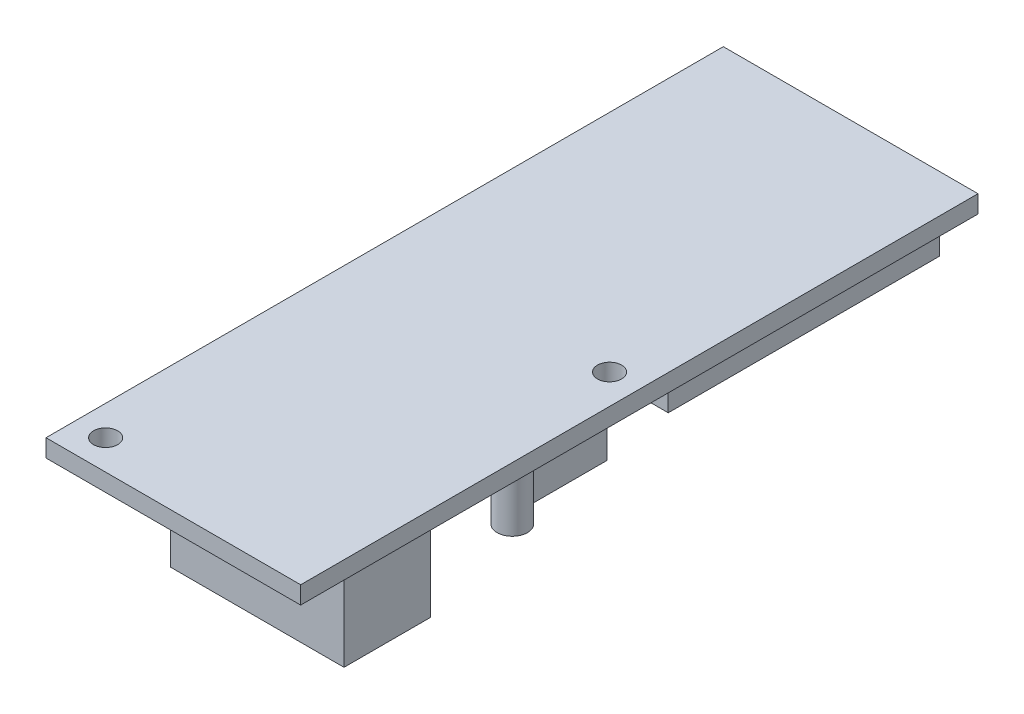
ISO-10303-21;
HEADER;
FILE_DESCRIPTION(('STEP AP214'),'2;1');
FILE_NAME('part.step','',(''),(''),'','','');
FILE_SCHEMA(('AUTOMOTIVE_DESIGN { 1 0 10303 214 1 1 1 1 }'));
ENDSEC;
DATA;
#1=APPLICATION_CONTEXT('core data for automotive mechanical design processes');
#2=APPLICATION_PROTOCOL_DEFINITION('international standard','automotive_design',2000,#1);
#3=PRODUCT_CONTEXT('',#1,'mechanical');
#4=PRODUCT('Part','Part','',(#3));
#5=PRODUCT_RELATED_PRODUCT_CATEGORY('part','',(#4));
#6=PRODUCT_DEFINITION_FORMATION('','',#4);
#7=PRODUCT_DEFINITION_CONTEXT('part definition',#1,'design');
#8=PRODUCT_DEFINITION('design','',#6,#7);
#9=PRODUCT_DEFINITION_SHAPE('','',#8);
#10=(LENGTH_UNIT() NAMED_UNIT(*) SI_UNIT(.MILLI.,.METRE.));
#11=(NAMED_UNIT(*) PLANE_ANGLE_UNIT() SI_UNIT($,.RADIAN.));
#12=(NAMED_UNIT(*) SI_UNIT($,.STERADIAN.) SOLID_ANGLE_UNIT());
#13=UNCERTAINTY_MEASURE_WITH_UNIT(LENGTH_MEASURE(1.E-05),#10,'distance_accuracy_value','');
#14=(GEOMETRIC_REPRESENTATION_CONTEXT(3) GLOBAL_UNCERTAINTY_ASSIGNED_CONTEXT((#13)) GLOBAL_UNIT_ASSIGNED_CONTEXT((#10,
#11,#12)) REPRESENTATION_CONTEXT('',''));
#15=CARTESIAN_POINT('',(0.,0.,0.));
#16=DIRECTION('',(0.,0.,1.));
#17=DIRECTION('',(1.,0.,0.));
#18=AXIS2_PLACEMENT_3D('',#15,#16,#17);
#19=CARTESIAN_POINT('',(-2.69215607971696,-10.7696,4.61445895033206));
#20=DIRECTION('',(0.00341761482106001,0.,0.999994159937414));
#21=DIRECTION('',(0.999994159937414,0.,-0.00341761482106001));
#22=AXIS2_PLACEMENT_3D('',#19,#20,#21);
#23=PLANE('',#22);
#24=DIRECTION('',(0.999994159937414,0.,-0.00341761482106001));
#25=VECTOR('',#24,1.);
#26=CARTESIAN_POINT('',(-2.69215607971696,-1.651,4.61445895033206));
#27=LINE('',#26,#25);
#28=CARTESIAN_POINT('',(-10.820156079717,-1.651,4.64223748582602));
#29=VERTEX_POINT('',#28);
#30=CARTESIAN_POINT('',(5.43584392028302,-1.651,4.5866804148381));
#31=VERTEX_POINT('',#30);
#32=EDGE_CURVE('E434',#29,#31,#27,.T.);
#33=ORIENTED_EDGE('',*,*,#32,.F.);
#34=DIRECTION('',(0.,1.,0.));
#35=VECTOR('',#34,1.);
#36=CARTESIAN_POINT('',(-10.820156079717,-10.7696,4.64223748582602));
#37=LINE('',#36,#35);
#38=CARTESIAN_POINT('',(-10.820156079717,-10.7696,4.64223748582602));
#39=VERTEX_POINT('',#38);
#40=EDGE_CURVE('E10',#39,#29,#37,.T.);
#41=ORIENTED_EDGE('',*,*,#40,.F.);
#42=DIRECTION('',(0.999994159937414,0.,-0.00341761482106001));
#43=VECTOR('',#42,1.);
#44=CARTESIAN_POINT('',(-2.69215607971696,-10.7696,4.61445895033206));
#45=LINE('',#44,#43);
#46=CARTESIAN_POINT('',(5.43584392028302,-10.7696,4.5866804148381));
#47=VERTEX_POINT('',#46);
#48=EDGE_CURVE('E435',#39,#47,#45,.T.);
#49=ORIENTED_EDGE('',*,*,#48,.T.);
#50=DIRECTION('',(0.,1.,0.));
#51=VECTOR('',#50,1.);
#52=CARTESIAN_POINT('',(5.43584392028302,-10.7696,4.5866804148381));
#53=LINE('',#52,#51);
#54=EDGE_CURVE('E38',#47,#31,#53,.T.);
#55=ORIENTED_EDGE('',*,*,#54,.T.);
#56=EDGE_LOOP('',(#33,#41,#49,#55));
#57=FACE_BOUND('',#56,.T.);
#58=ADVANCED_FACE('F16',(#57),#23,.T.);
#59=CARTESIAN_POINT('',(-10.820156079717,-10.7696,0.578237485826018));
#60=DIRECTION('',(1.,0.,0.));
#61=DIRECTION('',(0.,0.,-1.));
#62=AXIS2_PLACEMENT_3D('',#59,#60,#61);
#63=PLANE('',#62);
#64=DIRECTION('',(0.,0.,-1.));
#65=VECTOR('',#64,1.);
#66=CARTESIAN_POINT('',(-10.820156079717,-1.651,0.578237485826018));
#67=LINE('',#66,#65);
#68=CARTESIAN_POINT('',(-10.820156079717,-1.651,-3.48576251417398));
#69=VERTEX_POINT('',#68);
#70=EDGE_CURVE('E58',#29,#69,#67,.T.);
#71=ORIENTED_EDGE('',*,*,#70,.T.);
#72=DIRECTION('',(0.,1.,0.));
#73=VECTOR('',#72,1.);
#74=CARTESIAN_POINT('',(-10.820156079717,-10.7696,-3.48576251417398));
#75=LINE('',#74,#73);
#76=CARTESIAN_POINT('',(-10.820156079717,-10.7696,-3.48576251417398));
#77=VERTEX_POINT('',#76);
#78=EDGE_CURVE('E25',#77,#69,#75,.T.);
#79=ORIENTED_EDGE('',*,*,#78,.F.);
#80=DIRECTION('',(0.,0.,-1.));
#81=VECTOR('',#80,1.);
#82=CARTESIAN_POINT('',(-10.820156079717,-10.7696,0.578237485826018));
#83=LINE('',#82,#81);
#84=EDGE_CURVE('E438',#39,#77,#83,.T.);
#85=ORIENTED_EDGE('',*,*,#84,.F.);
#86=ORIENTED_EDGE('',*,*,#40,.T.);
#87=EDGE_LOOP('',(#71,#79,#85,#86));
#88=FACE_BOUND('',#87,.T.);
#89=ADVANCED_FACE('F479',(#88),#63,.F.);
#90=CARTESIAN_POINT('',(-2.69215607971698,-10.7696,-3.48576251417398));
#91=DIRECTION('',(0.,0.,1.));
#92=DIRECTION('',(1.,0.,0.));
#93=AXIS2_PLACEMENT_3D('',#90,#91,#92);
#94=PLANE('',#93);
#95=DIRECTION('',(1.,0.,0.));
#96=VECTOR('',#95,1.);
#97=CARTESIAN_POINT('',(-2.69215607971698,-1.651,-3.48576251417398));
#98=LINE('',#97,#96);
#99=CARTESIAN_POINT('',(5.43584392028302,-1.651,-3.48576251417398));
#100=VERTEX_POINT('',#99);
#101=EDGE_CURVE('E453',#69,#100,#98,.T.);
#102=ORIENTED_EDGE('',*,*,#101,.T.);
#103=DIRECTION('',(0.,1.,0.));
#104=VECTOR('',#103,1.);
#105=CARTESIAN_POINT('',(5.43584392028302,-10.7696,-3.48576251417398));
#106=LINE('',#105,#104);
#107=CARTESIAN_POINT('',(5.43584392028302,-10.7696,-3.48576251417398));
#108=VERTEX_POINT('',#107);
#109=EDGE_CURVE('E461',#108,#100,#106,.T.);
#110=ORIENTED_EDGE('',*,*,#109,.F.);
#111=DIRECTION('',(1.,0.,0.));
#112=VECTOR('',#111,1.);
#113=CARTESIAN_POINT('',(-2.69215607971698,-10.7696,-3.48576251417398));
#114=LINE('',#113,#112);
#115=EDGE_CURVE('E442',#77,#108,#114,.T.);
#116=ORIENTED_EDGE('',*,*,#115,.F.);
#117=ORIENTED_EDGE('',*,*,#78,.T.);
#118=EDGE_LOOP('',(#102,#110,#116,#117));
#119=FACE_BOUND('',#118,.T.);
#120=ADVANCED_FACE('F469',(#119),#94,.F.);
#121=CARTESIAN_POINT('',(5.43584392028302,-10.7696,0.550458950332057));
#122=DIRECTION('',(1.,0.,0.));
#123=DIRECTION('',(0.,0.,-1.));
#124=AXIS2_PLACEMENT_3D('',#121,#122,#123);
#125=PLANE('',#124);
#126=DIRECTION('',(0.,0.,-1.));
#127=VECTOR('',#126,1.);
#128=CARTESIAN_POINT('',(5.43584392028302,-1.651,0.550458950332057));
#129=LINE('',#128,#127);
#130=EDGE_CURVE('E439',#31,#100,#129,.T.);
#131=ORIENTED_EDGE('',*,*,#130,.F.);
#132=ORIENTED_EDGE('',*,*,#54,.F.);
#133=DIRECTION('',(0.,0.,-1.));
#134=VECTOR('',#133,1.);
#135=CARTESIAN_POINT('',(5.43584392028302,-10.7696,0.550458950332057));
#136=LINE('',#135,#134);
#137=EDGE_CURVE('E445',#47,#108,#136,.T.);
#138=ORIENTED_EDGE('',*,*,#137,.T.);
#139=ORIENTED_EDGE('',*,*,#109,.T.);
#140=EDGE_LOOP('',(#131,#132,#138,#139));
#141=FACE_BOUND('',#140,.T.);
#142=ADVANCED_FACE('F474',(#141),#125,.T.);
#143=CARTESIAN_POINT('',(17.6685890672207,-10.7696,0.));
#144=DIRECTION('',(0.,-1.,0.));
#145=DIRECTION('',(1.,0.,0.));
#146=AXIS2_PLACEMENT_3D('',#143,#144,#145);
#147=PLANE('',#146);
#148=ORIENTED_EDGE('',*,*,#48,.F.);
#149=ORIENTED_EDGE('',*,*,#84,.T.);
#150=ORIENTED_EDGE('',*,*,#115,.T.);
#151=ORIENTED_EDGE('',*,*,#137,.F.);
#152=EDGE_LOOP('',(#148,#149,#150,#151));
#153=FACE_BOUND('',#152,.T.);
#154=ADVANCED_FACE('F478',(#153),#147,.T.);
#155=CARTESIAN_POINT('',(0.,-1.651,0.));
#156=DIRECTION('',(0.,-1.,0.));
#157=DIRECTION('',(1.,0.,0.));
#158=AXIS2_PLACEMENT_3D('',#155,#156,#157);
#159=PLANE('',#158);
#160=ORIENTED_EDGE('',*,*,#70,.F.);
#161=ORIENTED_EDGE('',*,*,#32,.T.);
#162=ORIENTED_EDGE('',*,*,#130,.T.);
#163=ORIENTED_EDGE('',*,*,#101,.F.);
#164=EDGE_LOOP('',(#160,#161,#162,#163));
#165=FACE_BOUND('',#164,.T.);
#166=DIRECTION('',(1.,0.,0.));
#167=VECTOR('',#166,1.);
#168=CARTESIAN_POINT('',(1.77768610461801,-1.651,25.6540042306036));
#169=LINE('',#168,#167);
#170=CARTESIAN_POINT('',(-6.35031389538199,-1.651,25.6540042306036));
#171=VERTEX_POINT('',#170);
#172=CARTESIAN_POINT('',(9.90568610461802,-1.651,25.6540042306036));
#173=VERTEX_POINT('',#172);
#174=EDGE_CURVE('E232',#171,#173,#169,.T.);
#175=ORIENTED_EDGE('',*,*,#174,.T.);
#176=DIRECTION('',(0.,0.,-1.));
#177=VECTOR('',#176,1.);
#178=CARTESIAN_POINT('',(9.90568610461802,-1.651,21.5900042306036));
#179=LINE('',#178,#177);
#180=CARTESIAN_POINT('',(9.90568610461802,-1.651,17.5260042306035));
#181=VERTEX_POINT('',#180);
#182=EDGE_CURVE('E217',#173,#181,#179,.T.);
#183=ORIENTED_EDGE('',*,*,#182,.T.);
#184=DIRECTION('',(1.,0.,0.));
#185=VECTOR('',#184,1.);
#186=CARTESIAN_POINT('',(1.77768610461801,-1.651,17.5260042306035));
#187=LINE('',#186,#185);
#188=CARTESIAN_POINT('',(-6.35031389538198,-1.651,17.5260042306035));
#189=VERTEX_POINT('',#188);
#190=EDGE_CURVE('E249',#189,#181,#187,.T.);
#191=ORIENTED_EDGE('',*,*,#190,.F.);
#192=DIRECTION('',(0.,0.,-1.));
#193=VECTOR('',#192,1.);
#194=CARTESIAN_POINT('',(-6.35031389538199,-1.651,21.5900042306036));
#195=LINE('',#194,#193);
#196=EDGE_CURVE('E253',#171,#189,#195,.T.);
#197=ORIENTED_EDGE('',*,*,#196,.F.);
#198=EDGE_LOOP('',(#175,#183,#191,#197));
#199=FACE_BOUND('',#198,.T.);
#200=CARTESIAN_POINT('',(8.91875382512808,-1.651,8.89));
#201=DIRECTION('',(0.,-1.,0.));
#202=DIRECTION('',(0.,0.,-1.));
#203=AXIS2_PLACEMENT_3D('',#200,#201,#202);
#204=CIRCLE('',#203,1.4224);
#205=CARTESIAN_POINT('',(8.91875382512808,-1.651,7.4676));
#206=VERTEX_POINT('',#205);
#207=EDGE_CURVE('E261',#206,#206,#204,.T.);
#208=ORIENTED_EDGE('',*,*,#207,.F.);
#209=EDGE_LOOP('',(#208));
#210=FACE_BOUND('',#209,.T.);
#211=CARTESIAN_POINT('',(-9.30180866271257,-1.651,21.5009637176991));
#212=DIRECTION('',(0.,-1.,0.));
#213=DIRECTION('',(0.,0.,-1.));
#214=AXIS2_PLACEMENT_3D('',#211,#212,#213);
#215=CIRCLE('',#214,1.5875);
#216=CARTESIAN_POINT('',(-9.30180866271257,-1.651,19.9134637176991));
#217=VERTEX_POINT('',#216);
#218=EDGE_CURVE('E271',#217,#217,#215,.T.);
#219=ORIENTED_EDGE('',*,*,#218,.F.);
#220=EDGE_LOOP('',(#219));
#221=FACE_BOUND('',#220,.T.);
#222=DIRECTION('',(1.,0.,0.));
#223=VECTOR('',#222,1.);
#224=CARTESIAN_POINT('',(-10.1213033776045,-1.651,-18.3387992003917));
#225=LINE('',#224,#223);
#226=CARTESIAN_POINT('',(-11.3214533776045,-1.651,-18.3387992003917));
#227=VERTEX_POINT('',#226);
#228=CARTESIAN_POINT('',(-8.92115337760448,-1.651,-18.3387992003917));
#229=VERTEX_POINT('',#228);
#230=EDGE_CURVE('E279',#227,#229,#225,.T.);
#231=ORIENTED_EDGE('',*,*,#230,.T.);
#232=DIRECTION('',(0.,0.,-1.));
#233=VECTOR('',#232,1.);
#234=CARTESIAN_POINT('',(-8.92115337760448,-1.651,-20.8279992003917));
#235=LINE('',#234,#233);
#236=CARTESIAN_POINT('',(-8.92115337760448,-1.651,-23.3171992003917));
#237=VERTEX_POINT('',#236);
#238=EDGE_CURVE('E288',#229,#237,#235,.T.);
#239=ORIENTED_EDGE('',*,*,#238,.T.);
#240=DIRECTION('',(1.,0.,0.));
#241=VECTOR('',#240,1.);
#242=CARTESIAN_POINT('',(-10.1213033776045,-1.651,-23.3171992003917));
#243=LINE('',#242,#241);
#244=CARTESIAN_POINT('',(-11.3214533776045,-1.651,-23.3171992003917));
#245=VERTEX_POINT('',#244);
#246=EDGE_CURVE('E305',#245,#237,#243,.T.);
#247=ORIENTED_EDGE('',*,*,#246,.F.);
#248=DIRECTION('',(0.,0.,-1.));
#249=VECTOR('',#248,1.);
#250=CARTESIAN_POINT('',(-11.3214533776045,-1.651,-20.8279992003917));
#251=LINE('',#250,#249);
#252=EDGE_CURVE('E301',#227,#245,#251,.T.);
#253=ORIENTED_EDGE('',*,*,#252,.F.);
#254=EDGE_LOOP('',(#231,#239,#247,#253));
#255=FACE_BOUND('',#254,.T.);
#256=CARTESIAN_POINT('',(9.144,-1.651,0.));
#257=DIRECTION('',(0.,-1.,0.));
#258=DIRECTION('',(0.,0.,-1.));
#259=AXIS2_PLACEMENT_3D('',#256,#257,#258);
#260=CIRCLE('',#259,1.1303);
#261=CARTESIAN_POINT('',(9.144,-1.651,-1.1303));
#262=VERTEX_POINT('',#261);
#263=EDGE_CURVE('E338',#262,#262,#260,.F.);
#264=ORIENTED_EDGE('',*,*,#263,.T.);
#265=EDGE_LOOP('',(#264));
#266=FACE_BOUND('',#265,.T.);
#267=CARTESIAN_POINT('',(-9.144,-1.651,28.956));
#268=DIRECTION('',(0.,-1.,0.));
#269=DIRECTION('',(0.,0.,-1.));
#270=AXIS2_PLACEMENT_3D('',#267,#268,#269);
#271=CIRCLE('',#270,1.1303);
#272=CARTESIAN_POINT('',(-9.144,-1.651,27.8257));
#273=VERTEX_POINT('',#272);
#274=EDGE_CURVE('E331',#273,#273,#271,.F.);
#275=ORIENTED_EDGE('',*,*,#274,.T.);
#276=EDGE_LOOP('',(#275));
#277=FACE_BOUND('',#276,.T.);
#278=DIRECTION('',(1.,0.,0.));
#279=VECTOR('',#278,1.);
#280=CARTESIAN_POINT('',(0.0429229611926003,-1.651,-6.35));
#281=LINE('',#280,#279);
#282=CARTESIAN_POINT('',(-8.2120770388074,-1.651,-6.35));
#283=VERTEX_POINT('',#282);
#284=CARTESIAN_POINT('',(8.2979229611926,-1.651,-6.35));
#285=VERTEX_POINT('',#284);
#286=EDGE_CURVE('E347',#283,#285,#281,.T.);
#287=ORIENTED_EDGE('',*,*,#286,.T.);
#288=DIRECTION('',(0.,0.,-1.));
#289=VECTOR('',#288,1.);
#290=CARTESIAN_POINT('',(8.2979229611926,-1.651,-19.0563597335608));
#291=LINE('',#290,#289);
#292=CARTESIAN_POINT('',(8.29792296119261,-1.651,-31.75));
#293=VERTEX_POINT('',#292);
#294=EDGE_CURVE('E368',#285,#293,#291,.T.);
#295=ORIENTED_EDGE('',*,*,#294,.T.);
#296=DIRECTION('',(-1.,0.,0.));
#297=VECTOR('',#296,1.);
#298=CARTESIAN_POINT('',(0.,-1.651,-31.75));
#299=LINE('',#298,#297);
#300=CARTESIAN_POINT('',(11.938,-1.651,-31.75));
#301=VERTEX_POINT('',#300);
#302=EDGE_CURVE('E403',#301,#293,#299,.T.);
#303=ORIENTED_EDGE('',*,*,#302,.F.);
#304=DIRECTION('',(0.,0.,-1.));
#305=VECTOR('',#304,1.);
#306=CARTESIAN_POINT('',(11.938,-1.651,0.));
#307=LINE('',#306,#305);
#308=CARTESIAN_POINT('',(11.938,-1.651,31.75));
#309=VERTEX_POINT('',#308);
#310=EDGE_CURVE('E390',#309,#301,#307,.T.);
#311=ORIENTED_EDGE('',*,*,#310,.F.);
#312=DIRECTION('',(-1.,0.,0.));
#313=VECTOR('',#312,1.);
#314=CARTESIAN_POINT('',(0.,-1.651,31.75));
#315=LINE('',#314,#313);
#316=CARTESIAN_POINT('',(-11.938,-1.651,31.75));
#317=VERTEX_POINT('',#316);
#318=EDGE_CURVE('E394',#309,#317,#315,.T.);
#319=ORIENTED_EDGE('',*,*,#318,.T.);
#320=DIRECTION('',(0.,0.,-1.));
#321=VECTOR('',#320,1.);
#322=CARTESIAN_POINT('',(-11.938,-1.651,0.));
#323=LINE('',#322,#321);
#324=CARTESIAN_POINT('',(-11.938,-1.651,-31.75));
#325=VERTEX_POINT('',#324);
#326=EDGE_CURVE('E398',#317,#325,#323,.T.);
#327=ORIENTED_EDGE('',*,*,#326,.T.);
#328=CARTESIAN_POINT('',(-8.2120770388074,-1.651,-31.75));
#329=VERTEX_POINT('',#328);
#330=EDGE_CURVE('E402',#329,#325,#299,.T.);
#331=ORIENTED_EDGE('',*,*,#330,.F.);
#332=DIRECTION('',(0.,0.,-1.));
#333=VECTOR('',#332,1.);
#334=CARTESIAN_POINT('',(-8.2120770388074,-1.651,-19.0563597335608));
#335=LINE('',#334,#333);
#336=EDGE_CURVE('E359',#283,#329,#335,.T.);
#337=ORIENTED_EDGE('',*,*,#336,.F.);
#338=EDGE_LOOP('',(#287,#295,#303,#311,#319,#327,#331,#337));
#339=FACE_BOUND('',#338,.T.);
#340=ADVANCED_FACE('F472',(#165,#199,#210,#221,#255,#266,#277,#339),#159,.T.);
#341=CARTESIAN_POINT('',(11.938,-1.651,0.));
#342=DIRECTION('',(1.,0.,0.));
#343=DIRECTION('',(0.,0.,-1.));
#344=AXIS2_PLACEMENT_3D('',#341,#342,#343);
#345=PLANE('',#344);
#346=DIRECTION('',(0.,0.,-1.));
#347=VECTOR('',#346,1.);
#348=CARTESIAN_POINT('',(11.938,0.,0.));
#349=LINE('',#348,#347);
#350=CARTESIAN_POINT('',(11.938,0.,31.75));
#351=VERTEX_POINT('',#350);
#352=CARTESIAN_POINT('',(11.938,0.,-31.75));
#353=VERTEX_POINT('',#352);
#354=EDGE_CURVE('E379',#351,#353,#349,.T.);
#355=ORIENTED_EDGE('',*,*,#354,.F.);
#356=DIRECTION('',(0.,1.,0.));
#357=VECTOR('',#356,1.);
#358=CARTESIAN_POINT('',(11.938,-1.651,31.75));
#359=LINE('',#358,#357);
#360=EDGE_CURVE('E431',#309,#351,#359,.T.);
#361=ORIENTED_EDGE('',*,*,#360,.F.);
#362=ORIENTED_EDGE('',*,*,#310,.T.);
#363=DIRECTION('',(0.,1.,0.));
#364=VECTOR('',#363,1.);
#365=CARTESIAN_POINT('',(11.938,-1.651,-31.75));
#366=LINE('',#365,#364);
#367=EDGE_CURVE('E407',#301,#353,#366,.T.);
#368=ORIENTED_EDGE('',*,*,#367,.T.);
#369=EDGE_LOOP('',(#355,#361,#362,#368));
#370=FACE_BOUND('',#369,.T.);
#371=ADVANCED_FACE('F494',(#370),#345,.T.);
#372=CARTESIAN_POINT('',(0.,-1.651,31.75));
#373=DIRECTION('',(0.,0.,-1.));
#374=DIRECTION('',(-1.,0.,0.));
#375=AXIS2_PLACEMENT_3D('',#372,#373,#374);
#376=PLANE('',#375);
#377=DIRECTION('',(-1.,0.,0.));
#378=VECTOR('',#377,1.);
#379=CARTESIAN_POINT('',(0.,0.,31.75));
#380=LINE('',#379,#378);
#381=CARTESIAN_POINT('',(-11.938,0.,31.75));
#382=VERTEX_POINT('',#381);
#383=EDGE_CURVE('E412',#351,#382,#380,.T.);
#384=ORIENTED_EDGE('',*,*,#383,.T.);
#385=DIRECTION('',(0.,1.,0.));
#386=VECTOR('',#385,1.);
#387=CARTESIAN_POINT('',(-11.938,-1.651,31.75));
#388=LINE('',#387,#386);
#389=EDGE_CURVE('E427',#317,#382,#388,.T.);
#390=ORIENTED_EDGE('',*,*,#389,.F.);
#391=ORIENTED_EDGE('',*,*,#318,.F.);
#392=ORIENTED_EDGE('',*,*,#360,.T.);
#393=EDGE_LOOP('',(#384,#390,#391,#392));
#394=FACE_BOUND('',#393,.T.);
#395=ADVANCED_FACE('F497',(#394),#376,.F.);
#396=CARTESIAN_POINT('',(-11.938,-1.651,0.));
#397=DIRECTION('',(1.,0.,0.));
#398=DIRECTION('',(0.,0.,-1.));
#399=AXIS2_PLACEMENT_3D('',#396,#397,#398);
#400=PLANE('',#399);
#401=DIRECTION('',(0.,0.,-1.));
#402=VECTOR('',#401,1.);
#403=CARTESIAN_POINT('',(-11.938,0.,0.));
#404=LINE('',#403,#402);
#405=CARTESIAN_POINT('',(-11.938,0.,-31.75));
#406=VERTEX_POINT('',#405);
#407=EDGE_CURVE('E415',#382,#406,#404,.T.);
#408=ORIENTED_EDGE('',*,*,#407,.T.);
#409=DIRECTION('',(0.,1.,0.));
#410=VECTOR('',#409,1.);
#411=CARTESIAN_POINT('',(-11.938,-1.651,-31.75));
#412=LINE('',#411,#410);
#413=EDGE_CURVE('E424',#325,#406,#412,.T.);
#414=ORIENTED_EDGE('',*,*,#413,.F.);
#415=ORIENTED_EDGE('',*,*,#326,.F.);
#416=ORIENTED_EDGE('',*,*,#389,.T.);
#417=EDGE_LOOP('',(#408,#414,#415,#416));
#418=FACE_BOUND('',#417,.T.);
#419=ADVANCED_FACE('F501',(#418),#400,.F.);
#420=CARTESIAN_POINT('',(0.,-1.651,-31.75));
#421=DIRECTION('',(0.,0.,-1.));
#422=DIRECTION('',(-1.,0.,0.));
#423=AXIS2_PLACEMENT_3D('',#420,#421,#422);
#424=PLANE('',#423);
#425=DIRECTION('',(-1.,0.,0.));
#426=VECTOR('',#425,1.);
#427=CARTESIAN_POINT('',(0.,0.,-31.75));
#428=LINE('',#427,#426);
#429=EDGE_CURVE('E395',#353,#406,#428,.T.);
#430=ORIENTED_EDGE('',*,*,#429,.F.);
#431=ORIENTED_EDGE('',*,*,#367,.F.);
#432=ORIENTED_EDGE('',*,*,#302,.T.);
#433=EDGE_CURVE('E408',#293,#329,#299,.T.);
#434=ORIENTED_EDGE('',*,*,#433,.T.);
#435=ORIENTED_EDGE('',*,*,#330,.T.);
#436=ORIENTED_EDGE('',*,*,#413,.T.);
#437=EDGE_LOOP('',(#430,#431,#432,#434,#435,#436));
#438=FACE_BOUND('',#437,.T.);
#439=ADVANCED_FACE('F505',(#438),#424,.T.);
#440=CARTESIAN_POINT('',(0.,0.,0.));
#441=DIRECTION('',(0.,-1.,0.));
#442=DIRECTION('',(1.,0.,0.));
#443=AXIS2_PLACEMENT_3D('',#440,#441,#442);
#444=PLANE('',#443);
#445=CARTESIAN_POINT('',(9.144,0.,0.));
#446=DIRECTION('',(0.,1.,0.));
#447=DIRECTION('',(0.,0.,1.));
#448=AXIS2_PLACEMENT_3D('',#445,#446,#447);
#449=CIRCLE('',#448,1.1303);
#450=CARTESIAN_POINT('',(9.144,0.,1.1303));
#451=VERTEX_POINT('',#450);
#452=EDGE_CURVE('E327',#451,#451,#449,.T.);
#453=ORIENTED_EDGE('',*,*,#452,.F.);
#454=EDGE_LOOP('',(#453));
#455=FACE_BOUND('',#454,.T.);
#456=CARTESIAN_POINT('',(-9.144,0.,28.956));
#457=DIRECTION('',(0.,1.,0.));
#458=DIRECTION('',(0.,0.,1.));
#459=AXIS2_PLACEMENT_3D('',#456,#457,#458);
#460=CIRCLE('',#459,1.1303);
#461=CARTESIAN_POINT('',(-9.144,0.,30.0863));
#462=VERTEX_POINT('',#461);
#463=EDGE_CURVE('E326',#462,#462,#460,.T.);
#464=ORIENTED_EDGE('',*,*,#463,.F.);
#465=EDGE_LOOP('',(#464));
#466=FACE_BOUND('',#465,.T.);
#467=ORIENTED_EDGE('',*,*,#354,.T.);
#468=ORIENTED_EDGE('',*,*,#429,.T.);
#469=ORIENTED_EDGE('',*,*,#407,.F.);
#470=ORIENTED_EDGE('',*,*,#383,.F.);
#471=EDGE_LOOP('',(#467,#468,#469,#470));
#472=FACE_BOUND('',#471,.T.);
#473=ADVANCED_FACE('F509',(#455,#466,#472),#444,.F.);
#474=CARTESIAN_POINT('',(8.2979229611926,-6.91134,-19.0563597335608));
#475=DIRECTION('',(1.,0.,0.));
#476=DIRECTION('',(0.,0.,-1.));
#477=AXIS2_PLACEMENT_3D('',#474,#475,#476);
#478=PLANE('',#477);
#479=ORIENTED_EDGE('',*,*,#294,.F.);
#480=DIRECTION('',(0.,1.,0.));
#481=VECTOR('',#480,1.);
#482=CARTESIAN_POINT('',(8.2979229611926,-6.91134,-6.35));
#483=LINE('',#482,#481);
#484=CARTESIAN_POINT('',(8.2979229611926,-6.91134,-6.35));
#485=VERTEX_POINT('',#484);
#486=EDGE_CURVE('E375',#485,#285,#483,.T.);
#487=ORIENTED_EDGE('',*,*,#486,.F.);
#488=DIRECTION('',(0.,0.,-1.));
#489=VECTOR('',#488,1.);
#490=CARTESIAN_POINT('',(8.2979229611926,-6.91134,-19.0563597335608));
#491=LINE('',#490,#489);
#492=CARTESIAN_POINT('',(8.29792296119261,-6.91134,-31.7627194671216));
#493=VERTEX_POINT('',#492);
#494=EDGE_CURVE('E350',#485,#493,#491,.T.);
#495=ORIENTED_EDGE('',*,*,#494,.T.);
#496=DIRECTION('',(0.,1.,0.));
#497=VECTOR('',#496,1.);
#498=CARTESIAN_POINT('',(8.29792296119261,-6.91134,-31.7627194671216));
#499=LINE('',#498,#497);
#500=CARTESIAN_POINT('',(8.29792296119261,-1.651,-31.7627194671216));
#501=VERTEX_POINT('',#500);
#502=EDGE_CURVE('E358',#493,#501,#499,.T.);
#503=ORIENTED_EDGE('',*,*,#502,.T.);
#504=EDGE_CURVE('E367',#293,#501,#291,.T.);
#505=ORIENTED_EDGE('',*,*,#504,.F.);
#506=EDGE_LOOP('',(#479,#487,#495,#503,#505));
#507=FACE_BOUND('',#506,.T.);
#508=ADVANCED_FACE('F513',(#507),#478,.T.);
#509=CARTESIAN_POINT('',(0.0429229611926003,-6.91134,-6.35));
#510=DIRECTION('',(0.,0.,1.));
#511=DIRECTION('',(1.,0.,0.));
#512=AXIS2_PLACEMENT_3D('',#509,#510,#511);
#513=PLANE('',#512);
#514=ORIENTED_EDGE('',*,*,#286,.F.);
#515=DIRECTION('',(0.,1.,0.));
#516=VECTOR('',#515,1.);
#517=CARTESIAN_POINT('',(-8.2120770388074,-6.91134,-6.35));
#518=LINE('',#517,#516);
#519=CARTESIAN_POINT('',(-8.2120770388074,-6.91134,-6.35));
#520=VERTEX_POINT('',#519);
#521=EDGE_CURVE('E380',#520,#283,#518,.T.);
#522=ORIENTED_EDGE('',*,*,#521,.F.);
#523=DIRECTION('',(1.,0.,0.));
#524=VECTOR('',#523,1.);
#525=CARTESIAN_POINT('',(0.0429229611926003,-6.91134,-6.35));
#526=LINE('',#525,#524);
#527=EDGE_CURVE('E354',#520,#485,#526,.T.);
#528=ORIENTED_EDGE('',*,*,#527,.T.);
#529=ORIENTED_EDGE('',*,*,#486,.T.);
#530=EDGE_LOOP('',(#514,#522,#528,#529));
#531=FACE_BOUND('',#530,.T.);
#532=ADVANCED_FACE('F521',(#531),#513,.T.);
#533=CARTESIAN_POINT('',(-8.2120770388074,-6.91134,-19.0563597335608));
#534=DIRECTION('',(1.,0.,0.));
#535=DIRECTION('',(0.,0.,-1.));
#536=AXIS2_PLACEMENT_3D('',#533,#534,#535);
#537=PLANE('',#536);
#538=ORIENTED_EDGE('',*,*,#336,.T.);
#539=CARTESIAN_POINT('',(-8.2120770388074,-1.651,-31.7627194671216));
#540=VERTEX_POINT('',#539);
#541=EDGE_CURVE('E342',#329,#540,#335,.T.);
#542=ORIENTED_EDGE('',*,*,#541,.T.);
#543=DIRECTION('',(0.,1.,0.));
#544=VECTOR('',#543,1.);
#545=CARTESIAN_POINT('',(-8.2120770388074,-6.91134,-31.7627194671216));
#546=LINE('',#545,#544);
#547=CARTESIAN_POINT('',(-8.2120770388074,-6.91134,-31.7627194671216));
#548=VERTEX_POINT('',#547);
#549=EDGE_CURVE('E383',#548,#540,#546,.T.);
#550=ORIENTED_EDGE('',*,*,#549,.F.);
#551=DIRECTION('',(0.,0.,-1.));
#552=VECTOR('',#551,1.);
#553=CARTESIAN_POINT('',(-8.2120770388074,-6.91134,-19.0563597335608));
#554=LINE('',#553,#552);
#555=EDGE_CURVE('E343',#520,#548,#554,.T.);
#556=ORIENTED_EDGE('',*,*,#555,.F.);
#557=ORIENTED_EDGE('',*,*,#521,.T.);
#558=EDGE_LOOP('',(#538,#542,#550,#556,#557));
#559=FACE_BOUND('',#558,.T.);
#560=ADVANCED_FACE('F517',(#559),#537,.F.);
#561=CARTESIAN_POINT('',(0.0429229611926054,-6.91134,-31.7627194671216));
#562=DIRECTION('',(0.,0.,1.));
#563=DIRECTION('',(1.,0.,0.));
#564=AXIS2_PLACEMENT_3D('',#561,#562,#563);
#565=PLANE('',#564);
#566=DIRECTION('',(1.,0.,0.));
#567=VECTOR('',#566,1.);
#568=CARTESIAN_POINT('',(0.0429229611926054,-1.651,-31.7627194671216));
#569=LINE('',#568,#567);
#570=EDGE_CURVE('E363',#540,#501,#569,.T.);
#571=ORIENTED_EDGE('',*,*,#570,.T.);
#572=ORIENTED_EDGE('',*,*,#502,.F.);
#573=DIRECTION('',(1.,0.,0.));
#574=VECTOR('',#573,1.);
#575=CARTESIAN_POINT('',(0.0429229611926054,-6.91134,-31.7627194671216));
#576=LINE('',#575,#574);
#577=EDGE_CURVE('E346',#548,#493,#576,.T.);
#578=ORIENTED_EDGE('',*,*,#577,.F.);
#579=ORIENTED_EDGE('',*,*,#549,.T.);
#580=EDGE_LOOP('',(#571,#572,#578,#579));
#581=FACE_BOUND('',#580,.T.);
#582=ADVANCED_FACE('F520',(#581),#565,.F.);
#583=CARTESIAN_POINT('',(0.,-6.91134,-0.00635973356080677));
#584=DIRECTION('',(0.,-1.,0.));
#585=DIRECTION('',(1.,0.,0.));
#586=AXIS2_PLACEMENT_3D('',#583,#584,#585);
#587=PLANE('',#586);
#588=ORIENTED_EDGE('',*,*,#494,.F.);
#589=ORIENTED_EDGE('',*,*,#527,.F.);
#590=ORIENTED_EDGE('',*,*,#555,.T.);
#591=ORIENTED_EDGE('',*,*,#577,.T.);
#592=EDGE_LOOP('',(#588,#589,#590,#591));
#593=FACE_BOUND('',#592,.T.);
#594=ADVANCED_FACE('F525',(#593),#587,.T.);
#595=CARTESIAN_POINT('',(0.,-1.651,-0.00635973356080677));
#596=DIRECTION('',(0.,-1.,0.));
#597=DIRECTION('',(1.,0.,0.));
#598=AXIS2_PLACEMENT_3D('',#595,#596,#597);
#599=PLANE('',#598);
#600=ORIENTED_EDGE('',*,*,#433,.F.);
#601=ORIENTED_EDGE('',*,*,#504,.T.);
#602=ORIENTED_EDGE('',*,*,#570,.F.);
#603=ORIENTED_EDGE('',*,*,#541,.F.);
#604=EDGE_LOOP('',(#600,#601,#602,#603));
#605=FACE_BOUND('',#604,.T.);
#606=ADVANCED_FACE('F533',(#605),#599,.F.);
#607=CARTESIAN_POINT('',(-9.144,-68.5429159650022,28.956));
#608=DIRECTION('',(0.,1.,0.));
#609=DIRECTION('',(0.,0.,1.));
#610=AXIS2_PLACEMENT_3D('',#607,#608,#609);
#611=CYLINDRICAL_SURFACE('',#610,1.1303);
#612=ORIENTED_EDGE('',*,*,#274,.F.);
#613=EDGE_LOOP('',(#612));
#614=FACE_BOUND('',#613,.T.);
#615=ORIENTED_EDGE('',*,*,#463,.T.);
#616=EDGE_LOOP('',(#615));
#617=FACE_BOUND('',#616,.T.);
#618=ADVANCED_FACE('F536',(#614,#617),#611,.F.);
#619=CARTESIAN_POINT('',(9.144,-68.5429159650022,0.));
#620=DIRECTION('',(0.,1.,0.));
#621=DIRECTION('',(0.,0.,1.));
#622=AXIS2_PLACEMENT_3D('',#619,#620,#621);
#623=CYLINDRICAL_SURFACE('',#622,1.1303);
#624=ORIENTED_EDGE('',*,*,#263,.F.);
#625=EDGE_LOOP('',(#624));
#626=FACE_BOUND('',#625,.T.);
#627=ORIENTED_EDGE('',*,*,#452,.T.);
#628=EDGE_LOOP('',(#627));
#629=FACE_BOUND('',#628,.T.);
#630=ADVANCED_FACE('F543',(#626,#629),#623,.F.);
#631=CARTESIAN_POINT('',(-10.1213033776045,-10.541,-18.3387992003917));
#632=DIRECTION('',(0.,0.,1.));
#633=DIRECTION('',(1.,0.,0.));
#634=AXIS2_PLACEMENT_3D('',#631,#632,#633);
#635=PLANE('',#634);
#636=ORIENTED_EDGE('',*,*,#230,.F.);
#637=DIRECTION('',(0.,1.,0.));
#638=VECTOR('',#637,1.);
#639=CARTESIAN_POINT('',(-11.3214533776045,-10.541,-18.3387992003917));
#640=LINE('',#639,#638);
#641=CARTESIAN_POINT('',(-11.3214533776045,-10.541,-18.3387992003917));
#642=VERTEX_POINT('',#641);
#643=EDGE_CURVE('E322',#642,#227,#640,.T.);
#644=ORIENTED_EDGE('',*,*,#643,.F.);
#645=DIRECTION('',(1.,0.,0.));
#646=VECTOR('',#645,1.);
#647=CARTESIAN_POINT('',(-10.1213033776045,-10.541,-18.3387992003917));
#648=LINE('',#647,#646);
#649=CARTESIAN_POINT('',(-8.92115337760448,-10.541,-18.3387992003917));
#650=VERTEX_POINT('',#649);
#651=EDGE_CURVE('E283',#642,#650,#648,.T.);
#652=ORIENTED_EDGE('',*,*,#651,.T.);
#653=DIRECTION('',(0.,1.,0.));
#654=VECTOR('',#653,1.);
#655=CARTESIAN_POINT('',(-8.92115337760448,-10.541,-18.3387992003917));
#656=LINE('',#655,#654);
#657=EDGE_CURVE('E298',#650,#229,#656,.T.);
#658=ORIENTED_EDGE('',*,*,#657,.T.);
#659=EDGE_LOOP('',(#636,#644,#652,#658));
#660=FACE_BOUND('',#659,.T.);
#661=ADVANCED_FACE('F547',(#660),#635,.T.);
#662=CARTESIAN_POINT('',(-11.3214533776045,-10.541,-20.8279992003917));
#663=DIRECTION('',(1.,0.,0.));
#664=DIRECTION('',(0.,0.,-1.));
#665=AXIS2_PLACEMENT_3D('',#662,#663,#664);
#666=PLANE('',#665);
#667=ORIENTED_EDGE('',*,*,#252,.T.);
#668=DIRECTION('',(0.,1.,0.));
#669=VECTOR('',#668,1.);
#670=CARTESIAN_POINT('',(-11.3214533776045,-10.541,-23.3171992003917));
#671=LINE('',#670,#669);
#672=CARTESIAN_POINT('',(-11.3214533776045,-10.541,-23.3171992003917));
#673=VERTEX_POINT('',#672);
#674=EDGE_CURVE('E318',#673,#245,#671,.T.);
#675=ORIENTED_EDGE('',*,*,#674,.F.);
#676=DIRECTION('',(0.,0.,-1.));
#677=VECTOR('',#676,1.);
#678=CARTESIAN_POINT('',(-11.3214533776045,-10.541,-20.8279992003917));
#679=LINE('',#678,#677);
#680=EDGE_CURVE('E287',#642,#673,#679,.T.);
#681=ORIENTED_EDGE('',*,*,#680,.F.);
#682=ORIENTED_EDGE('',*,*,#643,.T.);
#683=EDGE_LOOP('',(#667,#675,#681,#682));
#684=FACE_BOUND('',#683,.T.);
#685=ADVANCED_FACE('F551',(#684),#666,.F.);
#686=CARTESIAN_POINT('',(-10.1213033776045,-10.541,-23.3171992003917));
#687=DIRECTION('',(0.,0.,1.));
#688=DIRECTION('',(1.,0.,0.));
#689=AXIS2_PLACEMENT_3D('',#686,#687,#688);
#690=PLANE('',#689);
#691=ORIENTED_EDGE('',*,*,#246,.T.);
#692=DIRECTION('',(0.,1.,0.));
#693=VECTOR('',#692,1.);
#694=CARTESIAN_POINT('',(-8.92115337760448,-10.541,-23.3171992003917));
#695=LINE('',#694,#693);
#696=CARTESIAN_POINT('',(-8.92115337760448,-10.541,-23.3171992003917));
#697=VERTEX_POINT('',#696);
#698=EDGE_CURVE('E314',#697,#237,#695,.T.);
#699=ORIENTED_EDGE('',*,*,#698,.F.);
#700=DIRECTION('',(1.,0.,0.));
#701=VECTOR('',#700,1.);
#702=CARTESIAN_POINT('',(-10.1213033776045,-10.541,-23.3171992003917));
#703=LINE('',#702,#701);
#704=EDGE_CURVE('E291',#673,#697,#703,.T.);
#705=ORIENTED_EDGE('',*,*,#704,.F.);
#706=ORIENTED_EDGE('',*,*,#674,.T.);
#707=EDGE_LOOP('',(#691,#699,#705,#706));
#708=FACE_BOUND('',#707,.T.);
#709=ADVANCED_FACE('F555',(#708),#690,.F.);
#710=CARTESIAN_POINT('',(-8.92115337760448,-10.541,-20.8279992003917));
#711=DIRECTION('',(1.,0.,0.));
#712=DIRECTION('',(0.,0.,-1.));
#713=AXIS2_PLACEMENT_3D('',#710,#711,#712);
#714=PLANE('',#713);
#715=ORIENTED_EDGE('',*,*,#238,.F.);
#716=ORIENTED_EDGE('',*,*,#657,.F.);
#717=DIRECTION('',(0.,0.,-1.));
#718=VECTOR('',#717,1.);
#719=CARTESIAN_POINT('',(-8.92115337760448,-10.541,-20.8279992003917));
#720=LINE('',#719,#718);
#721=EDGE_CURVE('E294',#650,#697,#720,.T.);
#722=ORIENTED_EDGE('',*,*,#721,.T.);
#723=ORIENTED_EDGE('',*,*,#698,.T.);
#724=EDGE_LOOP('',(#715,#716,#722,#723));
#725=FACE_BOUND('',#724,.T.);
#726=ADVANCED_FACE('F559',(#725),#714,.T.);
#727=CARTESIAN_POINT('',(0.,-10.541,0.));
#728=DIRECTION('',(0.,-1.,0.));
#729=DIRECTION('',(1.,0.,0.));
#730=AXIS2_PLACEMENT_3D('',#727,#728,#729);
#731=PLANE('',#730);
#732=ORIENTED_EDGE('',*,*,#651,.F.);
#733=ORIENTED_EDGE('',*,*,#680,.T.);
#734=ORIENTED_EDGE('',*,*,#704,.T.);
#735=ORIENTED_EDGE('',*,*,#721,.F.);
#736=EDGE_LOOP('',(#732,#733,#734,#735));
#737=FACE_BOUND('',#736,.T.);
#738=ADVANCED_FACE('F563',(#737),#731,.T.);
#739=CARTESIAN_POINT('',(-9.30180866271257,-8.001,21.5009637176991));
#740=DIRECTION('',(0.,1.,0.));
#741=DIRECTION('',(0.,0.,1.));
#742=AXIS2_PLACEMENT_3D('',#739,#740,#741);
#743=CYLINDRICAL_SURFACE('',#742,1.5875);
#744=CARTESIAN_POINT('',(-9.30180866271257,-8.001,21.5009637176991));
#745=DIRECTION('',(0.,-1.,0.));
#746=DIRECTION('',(0.,0.,-1.));
#747=AXIS2_PLACEMENT_3D('',#744,#745,#746);
#748=CIRCLE('',#747,1.5875);
#749=CARTESIAN_POINT('',(-9.30180866271257,-8.001,19.9134637176991));
#750=VERTEX_POINT('',#749);
#751=EDGE_CURVE('E275',#750,#750,#748,.T.);
#752=ORIENTED_EDGE('',*,*,#751,.F.);
#753=EDGE_LOOP('',(#752));
#754=FACE_BOUND('',#753,.T.);
#755=ORIENTED_EDGE('',*,*,#218,.T.);
#756=EDGE_LOOP('',(#755));
#757=FACE_BOUND('',#756,.T.);
#758=ADVANCED_FACE('F567',(#754,#757),#743,.T.);
#759=CARTESIAN_POINT('',(17.6685890672207,-8.001,0.));
#760=DIRECTION('',(0.,-1.,0.));
#761=DIRECTION('',(1.,0.,0.));
#762=AXIS2_PLACEMENT_3D('',#759,#760,#761);
#763=PLANE('',#762);
#764=ORIENTED_EDGE('',*,*,#751,.T.);
#765=EDGE_LOOP('',(#764));
#766=FACE_BOUND('',#765,.T.);
#767=ADVANCED_FACE('F571',(#766),#763,.T.);
#768=CARTESIAN_POINT('',(8.91875382512808,-8.001,8.89));
#769=DIRECTION('',(0.,1.,0.));
#770=DIRECTION('',(0.,0.,1.));
#771=AXIS2_PLACEMENT_3D('',#768,#769,#770);
#772=CYLINDRICAL_SURFACE('',#771,1.4224);
#773=CARTESIAN_POINT('',(8.91875382512808,-8.001,8.89));
#774=DIRECTION('',(0.,-1.,0.));
#775=DIRECTION('',(0.,0.,-1.));
#776=AXIS2_PLACEMENT_3D('',#773,#774,#775);
#777=CIRCLE('',#776,1.4224);
#778=CARTESIAN_POINT('',(8.91875382512808,-8.001,7.4676));
#779=VERTEX_POINT('',#778);
#780=EDGE_CURVE('E268',#779,#779,#777,.T.);
#781=ORIENTED_EDGE('',*,*,#780,.F.);
#782=EDGE_LOOP('',(#781));
#783=FACE_BOUND('',#782,.T.);
#784=ORIENTED_EDGE('',*,*,#207,.T.);
#785=EDGE_LOOP('',(#784));
#786=FACE_BOUND('',#785,.T.);
#787=ADVANCED_FACE('F575',(#783,#786),#772,.T.);
#788=CARTESIAN_POINT('',(17.6685890672207,-8.001,0.));
#789=DIRECTION('',(0.,-1.,0.));
#790=DIRECTION('',(1.,0.,0.));
#791=AXIS2_PLACEMENT_3D('',#788,#789,#790);
#792=PLANE('',#791);
#793=ORIENTED_EDGE('',*,*,#780,.T.);
#794=EDGE_LOOP('',(#793));
#795=FACE_BOUND('',#794,.T.);
#796=ADVANCED_FACE('F579',(#795),#792,.T.);
#797=CARTESIAN_POINT('',(1.77768610461801,-10.7696,25.6540042306036));
#798=DIRECTION('',(0.,0.,1.));
#799=DIRECTION('',(1.,0.,0.));
#800=AXIS2_PLACEMENT_3D('',#797,#798,#799);
#801=PLANE('',#800);
#802=ORIENTED_EDGE('',*,*,#174,.F.);
#803=DIRECTION('',(0.,1.,0.));
#804=VECTOR('',#803,1.);
#805=CARTESIAN_POINT('',(-6.35031389538198,-10.7696,25.6540042306036));
#806=LINE('',#805,#804);
#807=CARTESIAN_POINT('',(-6.35031389538198,-10.7696,25.6540042306036));
#808=VERTEX_POINT('',#807);
#809=EDGE_CURVE('E236',#808,#171,#806,.T.);
#810=ORIENTED_EDGE('',*,*,#809,.F.);
#811=DIRECTION('',(1.,0.,0.));
#812=VECTOR('',#811,1.);
#813=CARTESIAN_POINT('',(1.77768610461801,-10.7696,25.6540042306036));
#814=LINE('',#813,#812);
#815=CARTESIAN_POINT('',(9.90568610461802,-10.7696,25.6540042306036));
#816=VERTEX_POINT('',#815);
#817=EDGE_CURVE('E223',#808,#816,#814,.T.);
#818=ORIENTED_EDGE('',*,*,#817,.T.);
#819=DIRECTION('',(0.,1.,0.));
#820=VECTOR('',#819,1.);
#821=CARTESIAN_POINT('',(9.90568610461802,-10.7696,25.6540042306036));
#822=LINE('',#821,#820);
#823=EDGE_CURVE('E212',#816,#173,#822,.T.);
#824=ORIENTED_EDGE('',*,*,#823,.T.);
#825=EDGE_LOOP('',(#802,#810,#818,#824));
#826=FACE_BOUND('',#825,.T.);
#827=ADVANCED_FACE('F234',(#826),#801,.T.);
#828=CARTESIAN_POINT('',(-6.35031389538199,-10.7696,21.5900042306036));
#829=DIRECTION('',(1.,0.,0.));
#830=DIRECTION('',(0.,0.,-1.));
#831=AXIS2_PLACEMENT_3D('',#828,#829,#830);
#832=PLANE('',#831);
#833=ORIENTED_EDGE('',*,*,#196,.T.);
#834=DIRECTION('',(0.,1.,0.));
#835=VECTOR('',#834,1.);
#836=CARTESIAN_POINT('',(-6.35031389538198,-10.7696,17.5260042306035));
#837=LINE('',#836,#835);
#838=CARTESIAN_POINT('',(-6.35031389538198,-10.7696,17.5260042306035));
#839=VERTEX_POINT('',#838);
#840=EDGE_CURVE('E262',#839,#189,#837,.T.);
#841=ORIENTED_EDGE('',*,*,#840,.F.);
#842=DIRECTION('',(0.,0.,-1.));
#843=VECTOR('',#842,1.);
#844=CARTESIAN_POINT('',(-6.35031389538199,-10.7696,21.5900042306036));
#845=LINE('',#844,#843);
#846=EDGE_CURVE('E239',#808,#839,#845,.T.);
#847=ORIENTED_EDGE('',*,*,#846,.F.);
#848=ORIENTED_EDGE('',*,*,#809,.T.);
#849=EDGE_LOOP('',(#833,#841,#847,#848));
#850=FACE_BOUND('',#849,.T.);
#851=ADVANCED_FACE('F589',(#850),#832,.F.);
#852=CARTESIAN_POINT('',(1.77768610461801,-10.7696,17.5260042306035));
#853=DIRECTION('',(0.,0.,1.));
#854=DIRECTION('',(1.,0.,0.));
#855=AXIS2_PLACEMENT_3D('',#852,#853,#854);
#856=PLANE('',#855);
#857=ORIENTED_EDGE('',*,*,#190,.T.);
#858=DIRECTION('',(0.,1.,0.));
#859=VECTOR('',#858,1.);
#860=CARTESIAN_POINT('',(9.90568610461802,-10.7696,17.5260042306035));
#861=LINE('',#860,#859);
#862=CARTESIAN_POINT('',(9.90568610461802,-10.7696,17.5260042306035));
#863=VERTEX_POINT('',#862);
#864=EDGE_CURVE('E222',#863,#181,#861,.T.);
#865=ORIENTED_EDGE('',*,*,#864,.F.);
#866=DIRECTION('',(1.,0.,0.));
#867=VECTOR('',#866,1.);
#868=CARTESIAN_POINT('',(1.77768610461801,-10.7696,17.5260042306035));
#869=LINE('',#868,#867);
#870=EDGE_CURVE('E229',#839,#863,#869,.T.);
#871=ORIENTED_EDGE('',*,*,#870,.F.);
#872=ORIENTED_EDGE('',*,*,#840,.T.);
#873=EDGE_LOOP('',(#857,#865,#871,#872));
#874=FACE_BOUND('',#873,.T.);
#875=ADVANCED_FACE('F586',(#874),#856,.F.);
#876=CARTESIAN_POINT('',(9.90568610461802,-10.7696,21.5900042306036));
#877=DIRECTION('',(1.,0.,0.));
#878=DIRECTION('',(0.,0.,-1.));
#879=AXIS2_PLACEMENT_3D('',#876,#877,#878);
#880=PLANE('',#879);
#881=ORIENTED_EDGE('',*,*,#182,.F.);
#882=ORIENTED_EDGE('',*,*,#823,.F.);
#883=DIRECTION('',(0.,0.,-1.));
#884=VECTOR('',#883,1.);
#885=CARTESIAN_POINT('',(9.90568610461802,-10.7696,21.5900042306036));
#886=LINE('',#885,#884);
#887=EDGE_CURVE('E216',#816,#863,#886,.T.);
#888=ORIENTED_EDGE('',*,*,#887,.T.);
#889=ORIENTED_EDGE('',*,*,#864,.T.);
#890=EDGE_LOOP('',(#881,#882,#888,#889));
#891=FACE_BOUND('',#890,.T.);
#892=ADVANCED_FACE('F214',(#891),#880,.T.);
#893=CARTESIAN_POINT('',(17.6685890672207,-10.7696,0.));
#894=DIRECTION('',(0.,-1.,0.));
#895=DIRECTION('',(1.,0.,0.));
#896=AXIS2_PLACEMENT_3D('',#893,#894,#895);
#897=PLANE('',#896);
#898=ORIENTED_EDGE('',*,*,#817,.F.);
#899=ORIENTED_EDGE('',*,*,#846,.T.);
#900=ORIENTED_EDGE('',*,*,#870,.T.);
#901=ORIENTED_EDGE('',*,*,#887,.F.);
#902=EDGE_LOOP('',(#898,#899,#900,#901));
#903=FACE_BOUND('',#902,.T.);
#904=ADVANCED_FACE('F227',(#903),#897,.T.);
#905=CLOSED_SHELL('',(#58,#89,#120,#142,#154,#340,#371,#395,#419,#439,#473,#508,#532,#560,#582,
#594,#606,#618,#630,#661,#685,#709,#726,#738,#758,#767,#787,#796,#827,#851,#875,#892,#904));
#906=MANIFOLD_SOLID_BREP('B1',#905);
#907=ADVANCED_BREP_SHAPE_REPRESENTATION('',(#18,#906),#14);
#908=SHAPE_DEFINITION_REPRESENTATION(#9,#907);
ENDSEC;
END-ISO-10303-21;
